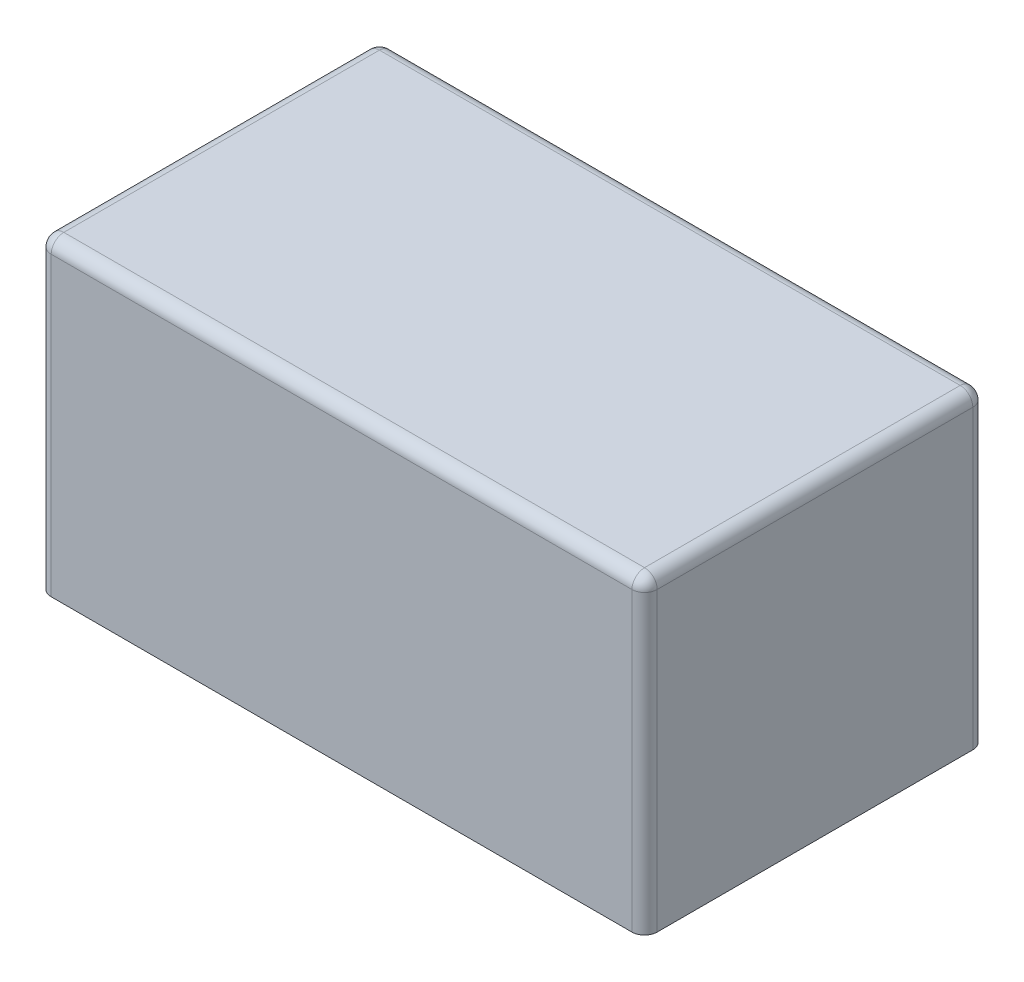
ISO-10303-21;
HEADER;
FILE_DESCRIPTION(('STEP AP214'),'2;1');
FILE_NAME('part.step','',(''),(''),'','','');
FILE_SCHEMA(('AUTOMOTIVE_DESIGN { 1 0 10303 214 1 1 1 1 }'));
ENDSEC;
DATA;
#1=APPLICATION_CONTEXT('core data for automotive mechanical design processes');
#2=APPLICATION_PROTOCOL_DEFINITION('international standard','automotive_design',2000,#1);
#3=PRODUCT_CONTEXT('',#1,'mechanical');
#4=PRODUCT('Part','Part','',(#3));
#5=PRODUCT_RELATED_PRODUCT_CATEGORY('part','',(#4));
#6=PRODUCT_DEFINITION_FORMATION('','',#4);
#7=PRODUCT_DEFINITION_CONTEXT('part definition',#1,'design');
#8=PRODUCT_DEFINITION('design','',#6,#7);
#9=PRODUCT_DEFINITION_SHAPE('','',#8);
#10=(LENGTH_UNIT() NAMED_UNIT(*) SI_UNIT(.MILLI.,.METRE.));
#11=(NAMED_UNIT(*) PLANE_ANGLE_UNIT() SI_UNIT($,.RADIAN.));
#12=(NAMED_UNIT(*) SI_UNIT($,.STERADIAN.) SOLID_ANGLE_UNIT());
#13=UNCERTAINTY_MEASURE_WITH_UNIT(LENGTH_MEASURE(1.E-05),#10,'distance_accuracy_value','');
#14=(GEOMETRIC_REPRESENTATION_CONTEXT(3) GLOBAL_UNCERTAINTY_ASSIGNED_CONTEXT((#13)) GLOBAL_UNIT_ASSIGNED_CONTEXT((#10,
#11,#12)) REPRESENTATION_CONTEXT('',''));
#15=CARTESIAN_POINT('',(0.,0.,0.));
#16=DIRECTION('',(0.,0.,1.));
#17=DIRECTION('',(1.,0.,0.));
#18=AXIS2_PLACEMENT_3D('',#15,#16,#17);
#19=CARTESIAN_POINT('',(-27.8519776422764,24.5,-20.1506666666667));
#20=DIRECTION('',(1.,0.,0.));
#21=DIRECTION('',(0.,0.,-1.));
#22=AXIS2_PLACEMENT_3D('',#19,#20,#21);
#23=PLANE('',#22);
#24=DIRECTION('',(0.,0.,1.));
#25=VECTOR('',#24,1.);
#26=CARTESIAN_POINT('',(-27.8519776422764,23.5,-20.1506666666667));
#27=LINE('',#26,#25);
#28=CARTESIAN_POINT('',(-27.8519776422764,23.5,5.84933333333334));
#29=VERTEX_POINT('',#28);
#30=CARTESIAN_POINT('',(-27.8519776422764,23.5,-19.1506666666667));
#31=VERTEX_POINT('',#30);
#32=EDGE_CURVE('E196',#29,#31,#27,.F.);
#33=ORIENTED_EDGE('',*,*,#32,.T.);
#34=DIRECTION('',(0.,-1.,0.));
#35=VECTOR('',#34,1.);
#36=CARTESIAN_POINT('',(-27.8519776422764,24.5,-19.1506666666667));
#37=LINE('',#36,#35);
#38=CARTESIAN_POINT('',(-27.8519776422764,0.,-19.1506666666667));
#39=VERTEX_POINT('',#38);
#40=EDGE_CURVE('E199',#31,#39,#37,.T.);
#41=ORIENTED_EDGE('',*,*,#40,.T.);
#42=DIRECTION('',(0.,0.,1.));
#43=VECTOR('',#42,1.);
#44=CARTESIAN_POINT('',(-27.8519776422764,0.,-20.1506666666667));
#45=LINE('',#44,#43);
#46=CARTESIAN_POINT('',(-27.8519776422764,0.,5.84933333333333));
#47=VERTEX_POINT('',#46);
#48=EDGE_CURVE('E174',#39,#47,#45,.T.);
#49=ORIENTED_EDGE('',*,*,#48,.T.);
#50=DIRECTION('',(0.,-1.,0.));
#51=VECTOR('',#50,1.);
#52=CARTESIAN_POINT('',(-27.8519776422764,24.5,5.84933333333333));
#53=LINE('',#52,#51);
#54=EDGE_CURVE('E194',#47,#29,#53,.F.);
#55=ORIENTED_EDGE('',*,*,#54,.T.);
#56=EDGE_LOOP('',(#33,#41,#49,#55));
#57=FACE_BOUND('',#56,.T.);
#58=ADVANCED_FACE('F33',(#57),#23,.F.);
#59=CARTESIAN_POINT('',(-27.8519776422764,24.5,6.84933333333334));
#60=DIRECTION('',(0.,0.,-1.));
#61=DIRECTION('',(-1.,0.,0.));
#62=AXIS2_PLACEMENT_3D('',#59,#60,#61);
#63=PLANE('',#62);
#64=DIRECTION('',(1.,0.,0.));
#65=VECTOR('',#64,1.);
#66=CARTESIAN_POINT('',(-27.8519776422764,0.,6.84933333333334));
#67=LINE('',#66,#65);
#68=CARTESIAN_POINT('',(-26.8519776422764,0.,6.84933333333334));
#69=VERTEX_POINT('',#68);
#70=CARTESIAN_POINT('',(19.1480223577236,0.,6.84933333333334));
#71=VERTEX_POINT('',#70);
#72=EDGE_CURVE('E177',#69,#71,#67,.T.);
#73=ORIENTED_EDGE('',*,*,#72,.T.);
#74=DIRECTION('',(0.,-1.,0.));
#75=VECTOR('',#74,1.);
#76=CARTESIAN_POINT('',(19.1480223577236,24.5,6.84933333333334));
#77=LINE('',#76,#75);
#78=CARTESIAN_POINT('',(19.1480223577236,23.5,6.84933333333334));
#79=VERTEX_POINT('',#78);
#80=EDGE_CURVE('E205',#71,#79,#77,.F.);
#81=ORIENTED_EDGE('',*,*,#80,.T.);
#82=DIRECTION('',(1.,0.,0.));
#83=VECTOR('',#82,1.);
#84=CARTESIAN_POINT('',(-27.8519776422764,23.5,6.84933333333334));
#85=LINE('',#84,#83);
#86=CARTESIAN_POINT('',(-26.8519776422764,23.5,6.84933333333334));
#87=VERTEX_POINT('',#86);
#88=EDGE_CURVE('E203',#79,#87,#85,.F.);
#89=ORIENTED_EDGE('',*,*,#88,.T.);
#90=DIRECTION('',(0.,-1.,0.));
#91=VECTOR('',#90,1.);
#92=CARTESIAN_POINT('',(-26.8519776422764,24.5,6.84933333333334));
#93=LINE('',#92,#91);
#94=EDGE_CURVE('E201',#87,#69,#93,.T.);
#95=ORIENTED_EDGE('',*,*,#94,.T.);
#96=EDGE_LOOP('',(#73,#81,#89,#95));
#97=FACE_BOUND('',#96,.T.);
#98=ADVANCED_FACE('F291',(#97),#63,.F.);
#99=CARTESIAN_POINT('',(20.1480223577236,24.5,-20.1506666666667));
#100=DIRECTION('',(-1.,0.,0.));
#101=DIRECTION('',(0.,0.,1.));
#102=AXIS2_PLACEMENT_3D('',#99,#100,#101);
#103=PLANE('',#102);
#104=DIRECTION('',(0.,0.,-1.));
#105=VECTOR('',#104,1.);
#106=CARTESIAN_POINT('',(20.1480223577236,0.,-20.1506666666667));
#107=LINE('',#106,#105);
#108=CARTESIAN_POINT('',(20.1480223577236,0.,5.84933333333333));
#109=VERTEX_POINT('',#108);
#110=CARTESIAN_POINT('',(20.1480223577236,0.,-19.1506666666667));
#111=VERTEX_POINT('',#110);
#112=EDGE_CURVE('E180',#109,#111,#107,.T.);
#113=ORIENTED_EDGE('',*,*,#112,.T.);
#114=DIRECTION('',(0.,-1.,0.));
#115=VECTOR('',#114,1.);
#116=CARTESIAN_POINT('',(20.1480223577236,24.5,-19.1506666666667));
#117=LINE('',#116,#115);
#118=CARTESIAN_POINT('',(20.1480223577236,23.5,-19.1506666666667));
#119=VERTEX_POINT('',#118);
#120=EDGE_CURVE('E211',#111,#119,#117,.F.);
#121=ORIENTED_EDGE('',*,*,#120,.T.);
#122=DIRECTION('',(0.,0.,-1.));
#123=VECTOR('',#122,1.);
#124=CARTESIAN_POINT('',(20.1480223577236,23.5,6.84933333333334));
#125=LINE('',#124,#123);
#126=CARTESIAN_POINT('',(20.1480223577236,23.5,5.84933333333333));
#127=VERTEX_POINT('',#126);
#128=EDGE_CURVE('E209',#119,#127,#125,.F.);
#129=ORIENTED_EDGE('',*,*,#128,.T.);
#130=DIRECTION('',(0.,-1.,0.));
#131=VECTOR('',#130,1.);
#132=CARTESIAN_POINT('',(20.1480223577236,24.5,5.84933333333333));
#133=LINE('',#132,#131);
#134=EDGE_CURVE('E207',#127,#109,#133,.T.);
#135=ORIENTED_EDGE('',*,*,#134,.T.);
#136=EDGE_LOOP('',(#113,#121,#129,#135));
#137=FACE_BOUND('',#136,.T.);
#138=ADVANCED_FACE('F277',(#137),#103,.F.);
#139=CARTESIAN_POINT('',(-27.8519776422764,24.5,-20.1506666666667));
#140=DIRECTION('',(0.,0.,1.));
#141=DIRECTION('',(1.,0.,0.));
#142=AXIS2_PLACEMENT_3D('',#139,#140,#141);
#143=PLANE('',#142);
#144=DIRECTION('',(-1.,0.,0.));
#145=VECTOR('',#144,1.);
#146=CARTESIAN_POINT('',(-27.8519776422764,0.,-20.1506666666667));
#147=LINE('',#146,#145);
#148=CARTESIAN_POINT('',(19.1480223577236,0.,-20.1506666666667));
#149=VERTEX_POINT('',#148);
#150=CARTESIAN_POINT('',(-26.8519776422764,0.,-20.1506666666667));
#151=VERTEX_POINT('',#150);
#152=EDGE_CURVE('E183',#149,#151,#147,.T.);
#153=ORIENTED_EDGE('',*,*,#152,.T.);
#154=DIRECTION('',(0.,-1.,0.));
#155=VECTOR('',#154,1.);
#156=CARTESIAN_POINT('',(-26.8519776422764,24.5,-20.1506666666667));
#157=LINE('',#156,#155);
#158=CARTESIAN_POINT('',(-26.8519776422764,23.5,-20.1506666666667));
#159=VERTEX_POINT('',#158);
#160=EDGE_CURVE('E58',#151,#159,#157,.F.);
#161=ORIENTED_EDGE('',*,*,#160,.T.);
#162=DIRECTION('',(-1.,0.,0.));
#163=VECTOR('',#162,1.);
#164=CARTESIAN_POINT('',(20.1480223577236,23.5,-20.1506666666667));
#165=LINE('',#164,#163);
#166=CARTESIAN_POINT('',(19.1480223577236,23.5,-20.1506666666667));
#167=VERTEX_POINT('',#166);
#168=EDGE_CURVE('E215',#159,#167,#165,.F.);
#169=ORIENTED_EDGE('',*,*,#168,.T.);
#170=DIRECTION('',(0.,-1.,0.));
#171=VECTOR('',#170,1.);
#172=CARTESIAN_POINT('',(19.1480223577236,24.5,-20.1506666666667));
#173=LINE('',#172,#171);
#174=EDGE_CURVE('E213',#167,#149,#173,.T.);
#175=ORIENTED_EDGE('',*,*,#174,.T.);
#176=EDGE_LOOP('',(#153,#161,#169,#175));
#177=FACE_BOUND('',#176,.T.);
#178=ADVANCED_FACE('F348',(#177),#143,.F.);
#179=CARTESIAN_POINT('',(0.,24.5,0.));
#180=DIRECTION('',(0.,1.,0.));
#181=DIRECTION('',(0.,0.,1.));
#182=AXIS2_PLACEMENT_3D('',#179,#180,#181);
#183=PLANE('',#182);
#184=DIRECTION('',(-1.,0.,0.));
#185=VECTOR('',#184,1.);
#186=CARTESIAN_POINT('',(-27.8519776422764,24.5,-19.1506666666667));
#187=LINE('',#186,#185);
#188=CARTESIAN_POINT('',(19.1480223577236,24.5,-19.1506666666667));
#189=VERTEX_POINT('',#188);
#190=CARTESIAN_POINT('',(-26.8519776422764,24.5,-19.1506666666667));
#191=VERTEX_POINT('',#190);
#192=EDGE_CURVE('E185',#189,#191,#187,.T.);
#193=ORIENTED_EDGE('',*,*,#192,.T.);
#194=DIRECTION('',(0.,0.,1.));
#195=VECTOR('',#194,1.);
#196=CARTESIAN_POINT('',(-26.8519776422764,24.5,6.84933333333334));
#197=LINE('',#196,#195);
#198=CARTESIAN_POINT('',(-26.8519776422764,24.5,5.84933333333334));
#199=VERTEX_POINT('',#198);
#200=EDGE_CURVE('E191',#191,#199,#197,.T.);
#201=ORIENTED_EDGE('',*,*,#200,.T.);
#202=DIRECTION('',(1.,0.,0.));
#203=VECTOR('',#202,1.);
#204=CARTESIAN_POINT('',(20.1480223577236,24.5,5.84933333333334));
#205=LINE('',#204,#203);
#206=CARTESIAN_POINT('',(19.1480223577236,24.5,5.84933333333334));
#207=VERTEX_POINT('',#206);
#208=EDGE_CURVE('E189',#199,#207,#205,.T.);
#209=ORIENTED_EDGE('',*,*,#208,.T.);
#210=DIRECTION('',(0.,0.,-1.));
#211=VECTOR('',#210,1.);
#212=CARTESIAN_POINT('',(19.1480223577236,24.5,-20.1506666666667));
#213=LINE('',#212,#211);
#214=EDGE_CURVE('E187',#207,#189,#213,.T.);
#215=ORIENTED_EDGE('',*,*,#214,.T.);
#216=EDGE_LOOP('',(#193,#201,#209,#215));
#217=FACE_BOUND('',#216,.T.);
#218=ADVANCED_FACE('F267',(#217),#183,.T.);
#219=CARTESIAN_POINT('',(0.,0.,0.));
#220=DIRECTION('',(0.,1.,0.));
#221=DIRECTION('',(0.,0.,1.));
#222=AXIS2_PLACEMENT_3D('',#219,#220,#221);
#223=PLANE('',#222);
#224=DIRECTION('',(1.,0.,0.));
#225=VECTOR('',#224,1.);
#226=CARTESIAN_POINT('',(-26.8519776422764,0.,-19.1506666666667));
#227=LINE('',#226,#225);
#228=CARTESIAN_POINT('',(-26.8519776422764,0.,-19.1506666666667));
#229=VERTEX_POINT('',#228);
#230=CARTESIAN_POINT('',(19.1480223577236,0.,-19.1506666666667));
#231=VERTEX_POINT('',#230);
#232=EDGE_CURVE('E164',#229,#231,#227,.T.);
#233=ORIENTED_EDGE('',*,*,#232,.F.);
#234=DIRECTION('',(0.,0.,-1.));
#235=VECTOR('',#234,1.);
#236=CARTESIAN_POINT('',(-26.8519776422764,0.,5.84933333333334));
#237=LINE('',#236,#235);
#238=CARTESIAN_POINT('',(-26.8519776422764,0.,5.84933333333334));
#239=VERTEX_POINT('',#238);
#240=EDGE_CURVE('E50',#239,#229,#237,.T.);
#241=ORIENTED_EDGE('',*,*,#240,.F.);
#242=DIRECTION('',(1.,0.,0.));
#243=VECTOR('',#242,1.);
#244=CARTESIAN_POINT('',(-26.8519776422764,0.,5.84933333333334));
#245=LINE('',#244,#243);
#246=CARTESIAN_POINT('',(19.1480223577236,0.,5.84933333333334));
#247=VERTEX_POINT('',#246);
#248=EDGE_CURVE('E155',#239,#247,#245,.T.);
#249=ORIENTED_EDGE('',*,*,#248,.T.);
#250=DIRECTION('',(0.,0.,-1.));
#251=VECTOR('',#250,1.);
#252=CARTESIAN_POINT('',(19.1480223577236,0.,5.84933333333334));
#253=LINE('',#252,#251);
#254=EDGE_CURVE('E158',#247,#231,#253,.T.);
#255=ORIENTED_EDGE('',*,*,#254,.T.);
#256=EDGE_LOOP('',(#233,#241,#249,#255));
#257=FACE_BOUND('',#256,.T.);
#258=ORIENTED_EDGE('',*,*,#48,.F.);
#259=CARTESIAN_POINT('',(-26.8519776422764,0.,-19.1506666666667));
#260=DIRECTION('',(0.,1.,0.));
#261=DIRECTION('',(0.,0.,1.));
#262=AXIS2_PLACEMENT_3D('',#259,#260,#261);
#263=CIRCLE('',#262,1.);
#264=EDGE_CURVE('E11',#39,#151,#263,.F.);
#265=ORIENTED_EDGE('',*,*,#264,.T.);
#266=ORIENTED_EDGE('',*,*,#152,.F.);
#267=CARTESIAN_POINT('',(19.1480223577236,0.,-19.1506666666667));
#268=DIRECTION('',(0.,1.,0.));
#269=DIRECTION('',(0.,0.,1.));
#270=AXIS2_PLACEMENT_3D('',#267,#268,#269);
#271=CIRCLE('',#270,1.);
#272=EDGE_CURVE('E42',#149,#111,#271,.F.);
#273=ORIENTED_EDGE('',*,*,#272,.T.);
#274=ORIENTED_EDGE('',*,*,#112,.F.);
#275=CARTESIAN_POINT('',(19.1480223577236,0.,5.84933333333333));
#276=DIRECTION('',(0.,1.,0.));
#277=DIRECTION('',(0.,0.,1.));
#278=AXIS2_PLACEMENT_3D('',#275,#276,#277);
#279=CIRCLE('',#278,1.);
#280=EDGE_CURVE('E220',#109,#71,#279,.F.);
#281=ORIENTED_EDGE('',*,*,#280,.T.);
#282=ORIENTED_EDGE('',*,*,#72,.F.);
#283=CARTESIAN_POINT('',(-26.8519776422764,0.,5.84933333333334));
#284=DIRECTION('',(0.,1.,0.));
#285=DIRECTION('',(0.,0.,1.));
#286=AXIS2_PLACEMENT_3D('',#283,#284,#285);
#287=CIRCLE('',#286,1.);
#288=EDGE_CURVE('E218',#69,#47,#287,.F.);
#289=ORIENTED_EDGE('',*,*,#288,.T.);
#290=EDGE_LOOP('',(#258,#265,#266,#273,#274,#281,#282,#289));
#291=FACE_BOUND('',#290,.T.);
#292=ADVANCED_FACE('F288',(#257,#291),#223,.F.);
#293=CARTESIAN_POINT('',(19.1480223577236,24.5,-19.1506666666667));
#294=DIRECTION('',(0.,-1.,0.));
#295=DIRECTION('',(0.,0.,-1.));
#296=AXIS2_PLACEMENT_3D('',#293,#294,#295);
#297=CYLINDRICAL_SURFACE('',#296,1.);
#298=ORIENTED_EDGE('',*,*,#272,.F.);
#299=ORIENTED_EDGE('',*,*,#174,.F.);
#300=CARTESIAN_POINT('',(19.1480223577236,23.5,-19.1506666666667));
#301=DIRECTION('',(0.,1.,0.));
#302=DIRECTION('',(0.,0.,1.));
#303=AXIS2_PLACEMENT_3D('',#300,#301,#302);
#304=CIRCLE('',#303,1.);
#305=EDGE_CURVE('E37',#119,#167,#304,.T.);
#306=ORIENTED_EDGE('',*,*,#305,.F.);
#307=ORIENTED_EDGE('',*,*,#120,.F.);
#308=EDGE_LOOP('',(#298,#299,#306,#307));
#309=FACE_BOUND('',#308,.T.);
#310=ADVANCED_FACE('F35',(#309),#297,.T.);
#311=CARTESIAN_POINT('',(19.1480223577236,23.5,0.));
#312=DIRECTION('',(0.,0.,1.));
#313=DIRECTION('',(1.,0.,0.));
#314=AXIS2_PLACEMENT_3D('',#311,#312,#313);
#315=CYLINDRICAL_SURFACE('',#314,1.);
#316=CARTESIAN_POINT('',(19.1480223577236,23.5,5.84933333333333));
#317=DIRECTION('',(0.,0.,1.));
#318=DIRECTION('',(0.,-1.,0.));
#319=AXIS2_PLACEMENT_3D('',#316,#317,#318);
#320=CIRCLE('',#319,1.);
#321=EDGE_CURVE('E247',#127,#207,#320,.T.);
#322=ORIENTED_EDGE('',*,*,#321,.F.);
#323=ORIENTED_EDGE('',*,*,#128,.F.);
#324=CARTESIAN_POINT('',(19.1480223577236,23.5,-19.1506666666667));
#325=DIRECTION('',(0.,0.,-1.));
#326=DIRECTION('',(-1.,0.,0.));
#327=AXIS2_PLACEMENT_3D('',#324,#325,#326);
#328=CIRCLE('',#327,1.);
#329=EDGE_CURVE('E249',#189,#119,#328,.T.);
#330=ORIENTED_EDGE('',*,*,#329,.F.);
#331=ORIENTED_EDGE('',*,*,#214,.F.);
#332=EDGE_LOOP('',(#322,#323,#330,#331));
#333=FACE_BOUND('',#332,.T.);
#334=ADVANCED_FACE('F274',(#333),#315,.T.);
#335=CARTESIAN_POINT('',(19.1480223577236,24.5,5.84933333333333));
#336=DIRECTION('',(0.,-1.,0.));
#337=DIRECTION('',(0.,0.,-1.));
#338=AXIS2_PLACEMENT_3D('',#335,#336,#337);
#339=CYLINDRICAL_SURFACE('',#338,1.);
#340=ORIENTED_EDGE('',*,*,#280,.F.);
#341=ORIENTED_EDGE('',*,*,#134,.F.);
#342=CARTESIAN_POINT('',(19.1480223577236,23.5,5.84933333333334));
#343=DIRECTION('',(0.,1.,0.));
#344=DIRECTION('',(0.,0.,1.));
#345=AXIS2_PLACEMENT_3D('',#342,#343,#344);
#346=CIRCLE('',#345,1.);
#347=EDGE_CURVE('E244',#79,#127,#346,.T.);
#348=ORIENTED_EDGE('',*,*,#347,.F.);
#349=ORIENTED_EDGE('',*,*,#80,.F.);
#350=EDGE_LOOP('',(#340,#341,#348,#349));
#351=FACE_BOUND('',#350,.T.);
#352=ADVANCED_FACE('F282',(#351),#339,.T.);
#353=CARTESIAN_POINT('',(19.1480223577236,23.5,-19.1506666666667));
#354=DIRECTION('',(0.,0.,1.));
#355=DIRECTION('',(1.,0.,0.));
#356=AXIS2_PLACEMENT_3D('',#353,#354,#355);
#357=SPHERICAL_SURFACE('',#356,1.);
#358=ORIENTED_EDGE('',*,*,#329,.T.);
#359=ORIENTED_EDGE('',*,*,#305,.T.);
#360=CARTESIAN_POINT('',(19.1480223577236,23.5,-19.1506666666667));
#361=DIRECTION('',(1.,0.,0.));
#362=DIRECTION('',(0.,0.,-1.));
#363=AXIS2_PLACEMENT_3D('',#360,#361,#362);
#364=CIRCLE('',#363,1.);
#365=EDGE_CURVE('E241',#189,#167,#364,.F.);
#366=ORIENTED_EDGE('',*,*,#365,.F.);
#367=EDGE_LOOP('',(#358,#359,#366));
#368=FACE_BOUND('',#367,.T.);
#369=ADVANCED_FACE('F256',(#368),#357,.T.);
#370=CARTESIAN_POINT('',(19.1480223577236,23.5,5.84933333333334));
#371=DIRECTION('',(0.,0.,1.));
#372=DIRECTION('',(1.,0.,0.));
#373=AXIS2_PLACEMENT_3D('',#370,#371,#372);
#374=SPHERICAL_SURFACE('',#373,1.);
#375=ORIENTED_EDGE('',*,*,#347,.T.);
#376=ORIENTED_EDGE('',*,*,#321,.T.);
#377=CARTESIAN_POINT('',(19.1480223577236,23.5,5.84933333333334));
#378=DIRECTION('',(1.,0.,0.));
#379=DIRECTION('',(0.,0.,-1.));
#380=AXIS2_PLACEMENT_3D('',#377,#378,#379);
#381=CIRCLE('',#380,1.);
#382=EDGE_CURVE('E238',#79,#207,#381,.F.);
#383=ORIENTED_EDGE('',*,*,#382,.F.);
#384=EDGE_LOOP('',(#375,#376,#383));
#385=FACE_BOUND('',#384,.T.);
#386=ADVANCED_FACE('F392',(#385),#374,.T.);
#387=CARTESIAN_POINT('',(-26.8519776422764,24.5,-19.1506666666667));
#388=DIRECTION('',(0.,-1.,0.));
#389=DIRECTION('',(0.,0.,-1.));
#390=AXIS2_PLACEMENT_3D('',#387,#388,#389);
#391=CYLINDRICAL_SURFACE('',#390,1.);
#392=ORIENTED_EDGE('',*,*,#264,.F.);
#393=ORIENTED_EDGE('',*,*,#40,.F.);
#394=CARTESIAN_POINT('',(-26.8519776422764,23.5,-19.1506666666667));
#395=DIRECTION('',(0.,1.,0.));
#396=DIRECTION('',(0.,0.,1.));
#397=AXIS2_PLACEMENT_3D('',#394,#395,#396);
#398=CIRCLE('',#397,1.);
#399=EDGE_CURVE('E235',#159,#31,#398,.T.);
#400=ORIENTED_EDGE('',*,*,#399,.F.);
#401=ORIENTED_EDGE('',*,*,#160,.F.);
#402=EDGE_LOOP('',(#392,#393,#400,#401));
#403=FACE_BOUND('',#402,.T.);
#404=ADVANCED_FACE('F312',(#403),#391,.T.);
#405=CARTESIAN_POINT('',(0.,23.5,-19.1506666666667));
#406=DIRECTION('',(1.,0.,0.));
#407=DIRECTION('',(0.,0.,-1.));
#408=AXIS2_PLACEMENT_3D('',#405,#406,#407);
#409=CYLINDRICAL_SURFACE('',#408,1.);
#410=ORIENTED_EDGE('',*,*,#365,.T.);
#411=ORIENTED_EDGE('',*,*,#168,.F.);
#412=CARTESIAN_POINT('',(-26.8519776422764,23.5,-19.1506666666667));
#413=DIRECTION('',(-1.,0.,0.));
#414=DIRECTION('',(0.,0.,1.));
#415=AXIS2_PLACEMENT_3D('',#412,#413,#414);
#416=CIRCLE('',#415,1.);
#417=EDGE_CURVE('E232',#191,#159,#416,.T.);
#418=ORIENTED_EDGE('',*,*,#417,.F.);
#419=ORIENTED_EDGE('',*,*,#192,.F.);
#420=EDGE_LOOP('',(#410,#411,#418,#419));
#421=FACE_BOUND('',#420,.T.);
#422=ADVANCED_FACE('F262',(#421),#409,.T.);
#423=CARTESIAN_POINT('',(0.,23.5,5.84933333333334));
#424=DIRECTION('',(-1.,0.,0.));
#425=DIRECTION('',(0.,0.,1.));
#426=AXIS2_PLACEMENT_3D('',#423,#424,#425);
#427=CYLINDRICAL_SURFACE('',#426,1.);
#428=ORIENTED_EDGE('',*,*,#382,.T.);
#429=ORIENTED_EDGE('',*,*,#208,.F.);
#430=CARTESIAN_POINT('',(-26.8519776422764,23.5,5.84933333333334));
#431=DIRECTION('',(-1.,0.,0.));
#432=DIRECTION('',(0.,0.,1.));
#433=AXIS2_PLACEMENT_3D('',#430,#431,#432);
#434=CIRCLE('',#433,1.);
#435=EDGE_CURVE('E229',#87,#199,#434,.T.);
#436=ORIENTED_EDGE('',*,*,#435,.F.);
#437=ORIENTED_EDGE('',*,*,#88,.F.);
#438=EDGE_LOOP('',(#428,#429,#436,#437));
#439=FACE_BOUND('',#438,.T.);
#440=ADVANCED_FACE('F301',(#439),#427,.T.);
#441=CARTESIAN_POINT('',(-26.8519776422764,24.5,5.84933333333334));
#442=DIRECTION('',(0.,-1.,0.));
#443=DIRECTION('',(0.,0.,-1.));
#444=AXIS2_PLACEMENT_3D('',#441,#442,#443);
#445=CYLINDRICAL_SURFACE('',#444,1.);
#446=ORIENTED_EDGE('',*,*,#288,.F.);
#447=ORIENTED_EDGE('',*,*,#94,.F.);
#448=CARTESIAN_POINT('',(-26.8519776422764,23.5,5.84933333333334));
#449=DIRECTION('',(0.,1.,0.));
#450=DIRECTION('',(0.,0.,1.));
#451=AXIS2_PLACEMENT_3D('',#448,#449,#450);
#452=CIRCLE('',#451,1.);
#453=EDGE_CURVE('E226',#29,#87,#452,.T.);
#454=ORIENTED_EDGE('',*,*,#453,.F.);
#455=ORIENTED_EDGE('',*,*,#54,.F.);
#456=EDGE_LOOP('',(#446,#447,#454,#455));
#457=FACE_BOUND('',#456,.T.);
#458=ADVANCED_FACE('F297',(#457),#445,.T.);
#459=CARTESIAN_POINT('',(-26.8519776422764,23.5,-19.1506666666667));
#460=DIRECTION('',(0.,0.,1.));
#461=DIRECTION('',(1.,0.,0.));
#462=AXIS2_PLACEMENT_3D('',#459,#460,#461);
#463=SPHERICAL_SURFACE('',#462,1.);
#464=ORIENTED_EDGE('',*,*,#417,.T.);
#465=ORIENTED_EDGE('',*,*,#399,.T.);
#466=CARTESIAN_POINT('',(-26.8519776422764,23.5,-19.1506666666667));
#467=DIRECTION('',(0.,0.,-1.));
#468=DIRECTION('',(-1.,0.,0.));
#469=AXIS2_PLACEMENT_3D('',#466,#467,#468);
#470=CIRCLE('',#469,1.);
#471=EDGE_CURVE('E224',#191,#31,#470,.F.);
#472=ORIENTED_EDGE('',*,*,#471,.F.);
#473=EDGE_LOOP('',(#464,#465,#472));
#474=FACE_BOUND('',#473,.T.);
#475=ADVANCED_FACE('F314',(#474),#463,.T.);
#476=CARTESIAN_POINT('',(-26.8519776422764,23.5,5.84933333333334));
#477=DIRECTION('',(0.,0.,1.));
#478=DIRECTION('',(1.,0.,0.));
#479=AXIS2_PLACEMENT_3D('',#476,#477,#478);
#480=SPHERICAL_SURFACE('',#479,1.);
#481=ORIENTED_EDGE('',*,*,#453,.T.);
#482=ORIENTED_EDGE('',*,*,#435,.T.);
#483=CARTESIAN_POINT('',(-26.8519776422764,23.5,5.84933333333334));
#484=DIRECTION('',(0.,0.,1.));
#485=DIRECTION('',(1.,0.,0.));
#486=AXIS2_PLACEMENT_3D('',#483,#484,#485);
#487=CIRCLE('',#486,1.);
#488=EDGE_CURVE('E170',#29,#199,#487,.F.);
#489=ORIENTED_EDGE('',*,*,#488,.F.);
#490=EDGE_LOOP('',(#481,#482,#489));
#491=FACE_BOUND('',#490,.T.);
#492=ADVANCED_FACE('F304',(#491),#480,.T.);
#493=CARTESIAN_POINT('',(-26.8519776422764,23.5,0.));
#494=DIRECTION('',(0.,0.,-1.));
#495=DIRECTION('',(-1.,0.,0.));
#496=AXIS2_PLACEMENT_3D('',#493,#494,#495);
#497=CYLINDRICAL_SURFACE('',#496,1.);
#498=ORIENTED_EDGE('',*,*,#471,.T.);
#499=ORIENTED_EDGE('',*,*,#32,.F.);
#500=ORIENTED_EDGE('',*,*,#488,.T.);
#501=ORIENTED_EDGE('',*,*,#200,.F.);
#502=EDGE_LOOP('',(#498,#499,#500,#501));
#503=FACE_BOUND('',#502,.T.);
#504=ADVANCED_FACE('F306',(#503),#497,.T.);
#505=CARTESIAN_POINT('',(-26.8519776422764,23.5,5.84933333333334));
#506=DIRECTION('',(-1.,0.,0.));
#507=DIRECTION('',(0.,0.,1.));
#508=AXIS2_PLACEMENT_3D('',#505,#506,#507);
#509=PLANE('',#508);
#510=ORIENTED_EDGE('',*,*,#240,.T.);
#511=DIRECTION('',(0.,-1.,0.));
#512=VECTOR('',#511,1.);
#513=CARTESIAN_POINT('',(-26.8519776422764,23.5,-19.1506666666667));
#514=LINE('',#513,#512);
#515=CARTESIAN_POINT('',(-26.8519776422764,23.5,-19.1506666666667));
#516=VERTEX_POINT('',#515);
#517=EDGE_CURVE('E134',#516,#229,#514,.T.);
#518=ORIENTED_EDGE('',*,*,#517,.F.);
#519=DIRECTION('',(0.,0.,-1.));
#520=VECTOR('',#519,1.);
#521=CARTESIAN_POINT('',(-26.8519776422764,23.5,5.84933333333334));
#522=LINE('',#521,#520);
#523=CARTESIAN_POINT('',(-26.8519776422764,23.5,5.84933333333334));
#524=VERTEX_POINT('',#523);
#525=EDGE_CURVE('E138',#524,#516,#522,.T.);
#526=ORIENTED_EDGE('',*,*,#525,.F.);
#527=DIRECTION('',(0.,-1.,0.));
#528=VECTOR('',#527,1.);
#529=CARTESIAN_POINT('',(-26.8519776422764,23.5,5.84933333333334));
#530=LINE('',#529,#528);
#531=EDGE_CURVE('E168',#524,#239,#530,.T.);
#532=ORIENTED_EDGE('',*,*,#531,.T.);
#533=EDGE_LOOP('',(#510,#518,#526,#532));
#534=FACE_BOUND('',#533,.T.);
#535=ADVANCED_FACE('F136',(#534),#509,.F.);
#536=CARTESIAN_POINT('',(-26.8519776422764,23.5,5.84933333333334));
#537=DIRECTION('',(0.,0.,-1.));
#538=DIRECTION('',(-1.,0.,0.));
#539=AXIS2_PLACEMENT_3D('',#536,#537,#538);
#540=PLANE('',#539);
#541=ORIENTED_EDGE('',*,*,#248,.F.);
#542=ORIENTED_EDGE('',*,*,#531,.F.);
#543=DIRECTION('',(1.,0.,0.));
#544=VECTOR('',#543,1.);
#545=CARTESIAN_POINT('',(-26.8519776422764,23.5,5.84933333333334));
#546=LINE('',#545,#544);
#547=CARTESIAN_POINT('',(19.1480223577236,23.5,5.84933333333334));
#548=VERTEX_POINT('',#547);
#549=EDGE_CURVE('E143',#524,#548,#546,.T.);
#550=ORIENTED_EDGE('',*,*,#549,.T.);
#551=DIRECTION('',(0.,-1.,0.));
#552=VECTOR('',#551,1.);
#553=CARTESIAN_POINT('',(19.1480223577236,23.5,5.84933333333334));
#554=LINE('',#553,#552);
#555=EDGE_CURVE('E171',#548,#247,#554,.T.);
#556=ORIENTED_EDGE('',*,*,#555,.T.);
#557=EDGE_LOOP('',(#541,#542,#550,#556));
#558=FACE_BOUND('',#557,.T.);
#559=ADVANCED_FACE('F335',(#558),#540,.T.);
#560=CARTESIAN_POINT('',(19.1480223577236,23.5,5.84933333333334));
#561=DIRECTION('',(-1.,0.,0.));
#562=DIRECTION('',(0.,0.,1.));
#563=AXIS2_PLACEMENT_3D('',#560,#561,#562);
#564=PLANE('',#563);
#565=ORIENTED_EDGE('',*,*,#254,.F.);
#566=ORIENTED_EDGE('',*,*,#555,.F.);
#567=DIRECTION('',(0.,0.,-1.));
#568=VECTOR('',#567,1.);
#569=CARTESIAN_POINT('',(19.1480223577236,23.5,5.84933333333334));
#570=LINE('',#569,#568);
#571=CARTESIAN_POINT('',(19.1480223577236,23.5,-19.1506666666667));
#572=VERTEX_POINT('',#571);
#573=EDGE_CURVE('E151',#548,#572,#570,.T.);
#574=ORIENTED_EDGE('',*,*,#573,.T.);
#575=DIRECTION('',(0.,-1.,0.));
#576=VECTOR('',#575,1.);
#577=CARTESIAN_POINT('',(19.1480223577236,23.5,-19.1506666666667));
#578=LINE('',#577,#576);
#579=EDGE_CURVE('E142',#572,#231,#578,.T.);
#580=ORIENTED_EDGE('',*,*,#579,.T.);
#581=EDGE_LOOP('',(#565,#566,#574,#580));
#582=FACE_BOUND('',#581,.T.);
#583=ADVANCED_FACE('F340',(#582),#564,.T.);
#584=CARTESIAN_POINT('',(-26.8519776422764,23.5,-19.1506666666667));
#585=DIRECTION('',(0.,0.,-1.));
#586=DIRECTION('',(-1.,0.,0.));
#587=AXIS2_PLACEMENT_3D('',#584,#585,#586);
#588=PLANE('',#587);
#589=ORIENTED_EDGE('',*,*,#232,.T.);
#590=ORIENTED_EDGE('',*,*,#579,.F.);
#591=DIRECTION('',(1.,0.,0.));
#592=VECTOR('',#591,1.);
#593=CARTESIAN_POINT('',(-26.8519776422764,23.5,-19.1506666666667));
#594=LINE('',#593,#592);
#595=EDGE_CURVE('E147',#516,#572,#594,.T.);
#596=ORIENTED_EDGE('',*,*,#595,.F.);
#597=ORIENTED_EDGE('',*,*,#517,.T.);
#598=EDGE_LOOP('',(#589,#590,#596,#597));
#599=FACE_BOUND('',#598,.T.);
#600=ADVANCED_FACE('F148',(#599),#588,.F.);
#601=CARTESIAN_POINT('',(0.,23.5,0.));
#602=DIRECTION('',(0.,-1.,0.));
#603=DIRECTION('',(0.,0.,-1.));
#604=AXIS2_PLACEMENT_3D('',#601,#602,#603);
#605=PLANE('',#604);
#606=ORIENTED_EDGE('',*,*,#525,.T.);
#607=ORIENTED_EDGE('',*,*,#595,.T.);
#608=ORIENTED_EDGE('',*,*,#573,.F.);
#609=ORIENTED_EDGE('',*,*,#549,.F.);
#610=EDGE_LOOP('',(#606,#607,#608,#609));
#611=FACE_BOUND('',#610,.T.);
#612=ADVANCED_FACE('F154',(#611),#605,.T.);
#613=CLOSED_SHELL('',(#58,#98,#138,#178,#218,#292,#310,#334,#352,#369,#386,#404,#422,#440,#458,
#475,#492,#504,#535,#559,#583,#600,#612));
#614=MANIFOLD_SOLID_BREP('B2',#613);
#615=ADVANCED_BREP_SHAPE_REPRESENTATION('',(#18,#614),#14);
#616=SHAPE_DEFINITION_REPRESENTATION(#9,#615);
ENDSEC;
END-ISO-10303-21;
